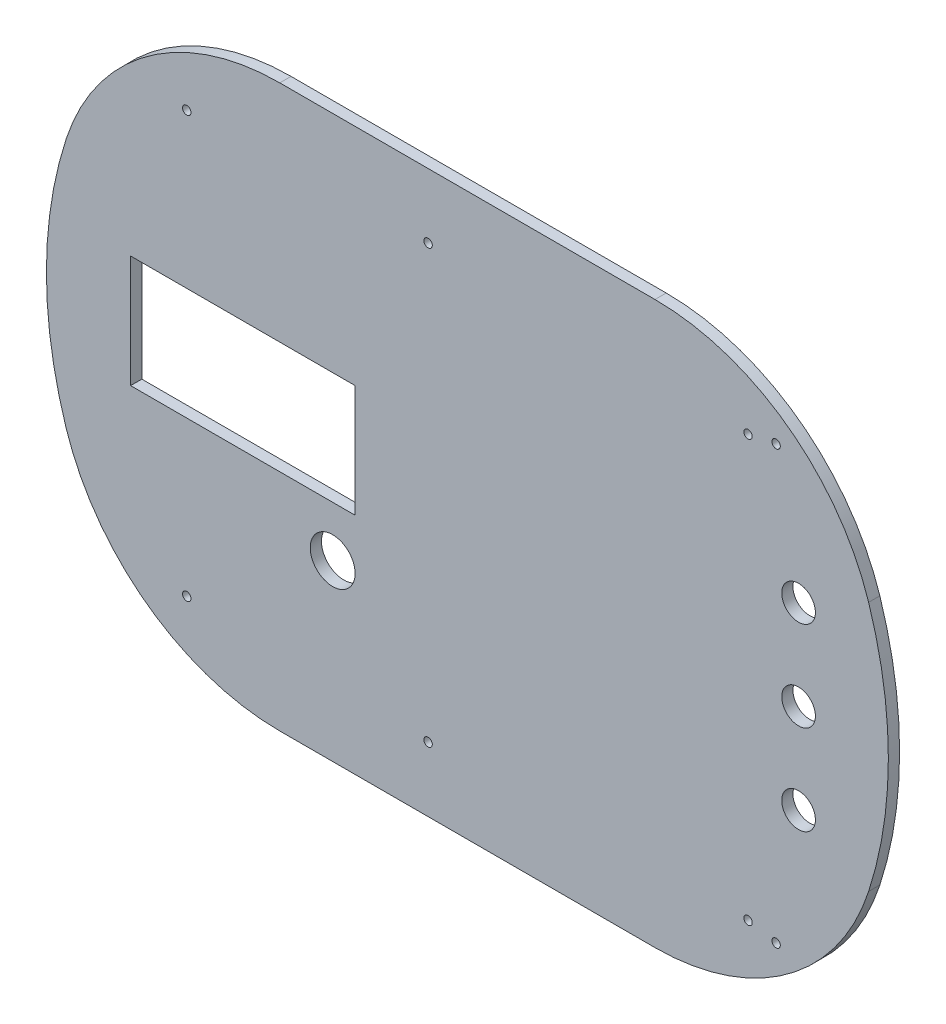
ISO-10303-21;
HEADER;
FILE_DESCRIPTION(('STEP AP214'),'2;1');
FILE_NAME('part.step','',(''),(''),'','','');
FILE_SCHEMA(('AUTOMOTIVE_DESIGN { 1 0 10303 214 1 1 1 1 }'));
ENDSEC;
DATA;
#1=APPLICATION_CONTEXT('core data for automotive mechanical design processes');
#2=APPLICATION_PROTOCOL_DEFINITION('international standard','automotive_design',2000,#1);
#3=PRODUCT_CONTEXT('',#1,'mechanical');
#4=PRODUCT('Part','Part','',(#3));
#5=PRODUCT_RELATED_PRODUCT_CATEGORY('part','',(#4));
#6=PRODUCT_DEFINITION_FORMATION('','',#4);
#7=PRODUCT_DEFINITION_CONTEXT('part definition',#1,'design');
#8=PRODUCT_DEFINITION('design','',#6,#7);
#9=PRODUCT_DEFINITION_SHAPE('','',#8);
#10=(LENGTH_UNIT() NAMED_UNIT(*) SI_UNIT(.MILLI.,.METRE.));
#11=(NAMED_UNIT(*) PLANE_ANGLE_UNIT() SI_UNIT($,.RADIAN.));
#12=(NAMED_UNIT(*) SI_UNIT($,.STERADIAN.) SOLID_ANGLE_UNIT());
#13=UNCERTAINTY_MEASURE_WITH_UNIT(LENGTH_MEASURE(1.E-05),#10,'distance_accuracy_value','');
#14=(GEOMETRIC_REPRESENTATION_CONTEXT(3) GLOBAL_UNCERTAINTY_ASSIGNED_CONTEXT((#13)) GLOBAL_UNIT_ASSIGNED_CONTEXT((#10,
#11,#12)) REPRESENTATION_CONTEXT('',''));
#15=CARTESIAN_POINT('',(0.,0.,0.));
#16=DIRECTION('',(0.,0.,1.));
#17=DIRECTION('',(1.,0.,0.));
#18=AXIS2_PLACEMENT_3D('',#15,#16,#17);
#19=CARTESIAN_POINT('',(0.,0.,2.));
#20=DIRECTION('',(0.,0.,1.));
#21=DIRECTION('',(1.,0.,0.));
#22=AXIS2_PLACEMENT_3D('',#19,#20,#21);
#23=PLANE('',#22);
#24=CARTESIAN_POINT('',(-50.,-37.5,2.));
#25=DIRECTION('',(0.,0.,1.));
#26=DIRECTION('',(1.,0.,0.));
#27=AXIS2_PLACEMENT_3D('',#24,#25,#26);
#28=CIRCLE('',#27,0.749999999999999);
#29=CARTESIAN_POINT('',(-49.25,-37.5,2.));
#30=VERTEX_POINT('',#29);
#31=EDGE_CURVE('E555',#30,#30,#28,.T.);
#32=ORIENTED_EDGE('',*,*,#31,.F.);
#33=EDGE_LOOP('',(#32));
#34=FACE_BOUND('',#33,.T.);
#35=CARTESIAN_POINT('',(50.,-37.5,2.));
#36=DIRECTION('',(0.,0.,1.));
#37=DIRECTION('',(1.,0.,0.));
#38=AXIS2_PLACEMENT_3D('',#35,#36,#37);
#39=CIRCLE('',#38,0.749999999999999);
#40=CARTESIAN_POINT('',(50.75,-37.5,2.));
#41=VERTEX_POINT('',#40);
#42=EDGE_CURVE('E557',#41,#41,#39,.T.);
#43=ORIENTED_EDGE('',*,*,#42,.F.);
#44=EDGE_LOOP('',(#43));
#45=FACE_BOUND('',#44,.T.);
#46=CARTESIAN_POINT('',(50.,37.5,2.));
#47=DIRECTION('',(0.,0.,1.));
#48=DIRECTION('',(1.,0.,0.));
#49=AXIS2_PLACEMENT_3D('',#46,#47,#48);
#50=CIRCLE('',#49,0.749999999999999);
#51=CARTESIAN_POINT('',(50.75,37.5,2.));
#52=VERTEX_POINT('',#51);
#53=EDGE_CURVE('E561',#52,#52,#50,.T.);
#54=ORIENTED_EDGE('',*,*,#53,.F.);
#55=EDGE_LOOP('',(#54));
#56=FACE_BOUND('',#55,.T.);
#57=CARTESIAN_POINT('',(-50.,37.5,2.));
#58=DIRECTION('',(0.,0.,1.));
#59=DIRECTION('',(1.,0.,0.));
#60=AXIS2_PLACEMENT_3D('',#57,#58,#59);
#61=CIRCLE('',#60,0.749999999999999);
#62=CARTESIAN_POINT('',(-49.25,37.5,2.));
#63=VERTEX_POINT('',#62);
#64=EDGE_CURVE('E297',#63,#63,#61,.T.);
#65=ORIENTED_EDGE('',*,*,#64,.F.);
#66=EDGE_LOOP('',(#65));
#67=FACE_BOUND('',#66,.T.);
#68=CARTESIAN_POINT('',(59.,16.,2.));
#69=DIRECTION('',(0.,0.,1.));
#70=DIRECTION('',(1.,0.,0.));
#71=AXIS2_PLACEMENT_3D('',#68,#69,#70);
#72=CIRCLE('',#71,3.);
#73=CARTESIAN_POINT('',(62.,16.,2.));
#74=VERTEX_POINT('',#73);
#75=EDGE_CURVE('E318',#74,#74,#72,.T.);
#76=ORIENTED_EDGE('',*,*,#75,.F.);
#77=EDGE_LOOP('',(#76));
#78=FACE_BOUND('',#77,.T.);
#79=CARTESIAN_POINT('',(55.,38.5,2.));
#80=DIRECTION('',(0.,0.,1.));
#81=DIRECTION('',(1.,0.,0.));
#82=AXIS2_PLACEMENT_3D('',#79,#80,#81);
#83=CIRCLE('',#82,0.750000000000001);
#84=CARTESIAN_POINT('',(55.75,38.5,2.));
#85=VERTEX_POINT('',#84);
#86=EDGE_CURVE('E330',#85,#85,#83,.F.);
#87=ORIENTED_EDGE('',*,*,#86,.T.);
#88=EDGE_LOOP('',(#87));
#89=FACE_BOUND('',#88,.T.);
#90=CARTESIAN_POINT('',(59.,-16.,2.));
#91=DIRECTION('',(0.,0.,1.));
#92=DIRECTION('',(1.,0.,0.));
#93=AXIS2_PLACEMENT_3D('',#90,#91,#92);
#94=CIRCLE('',#93,3.);
#95=CARTESIAN_POINT('',(62.,-16.,2.));
#96=VERTEX_POINT('',#95);
#97=EDGE_CURVE('E312',#96,#96,#94,.T.);
#98=ORIENTED_EDGE('',*,*,#97,.F.);
#99=EDGE_LOOP('',(#98));
#100=FACE_BOUND('',#99,.T.);
#101=CARTESIAN_POINT('',(59.,0.,2.));
#102=DIRECTION('',(0.,0.,1.));
#103=DIRECTION('',(1.,0.,0.));
#104=AXIS2_PLACEMENT_3D('',#101,#102,#103);
#105=CIRCLE('',#104,3.);
#106=CARTESIAN_POINT('',(62.,0.,2.));
#107=VERTEX_POINT('',#106);
#108=EDGE_CURVE('E307',#107,#107,#105,.T.);
#109=ORIENTED_EDGE('',*,*,#108,.F.);
#110=EDGE_LOOP('',(#109));
#111=FACE_BOUND('',#110,.T.);
#112=CARTESIAN_POINT('',(-6.99999999999999,38.5,2.));
#113=DIRECTION('',(0.,0.,1.));
#114=DIRECTION('',(1.,0.,0.));
#115=AXIS2_PLACEMENT_3D('',#112,#113,#114);
#116=CIRCLE('',#115,0.75);
#117=CARTESIAN_POINT('',(-6.24999999999999,38.5,2.));
#118=VERTEX_POINT('',#117);
#119=EDGE_CURVE('E268',#118,#118,#116,.T.);
#120=ORIENTED_EDGE('',*,*,#119,.F.);
#121=EDGE_LOOP('',(#120));
#122=FACE_BOUND('',#121,.T.);
#123=CARTESIAN_POINT('',(-24.,-19.,2.));
#124=DIRECTION('',(0.,0.,1.));
#125=DIRECTION('',(1.,0.,0.));
#126=AXIS2_PLACEMENT_3D('',#123,#124,#125);
#127=CIRCLE('',#126,4.);
#128=CARTESIAN_POINT('',(-20.,-19.,2.));
#129=VERTEX_POINT('',#128);
#130=EDGE_CURVE('E162',#129,#129,#127,.T.);
#131=ORIENTED_EDGE('',*,*,#130,.F.);
#132=EDGE_LOOP('',(#131));
#133=FACE_BOUND('',#132,.T.);
#134=DIRECTION('',(0.,1.,0.));
#135=VECTOR('',#134,1.);
#136=CARTESIAN_POINT('',(-20.,10.,2.));
#137=LINE('',#136,#135);
#138=CARTESIAN_POINT('',(-20.,-9.99999999999999,2.));
#139=VERTEX_POINT('',#138);
#140=CARTESIAN_POINT('',(-20.,10.,2.));
#141=VERTEX_POINT('',#140);
#142=EDGE_CURVE('E58',#139,#141,#137,.T.);
#143=ORIENTED_EDGE('',*,*,#142,.F.);
#144=DIRECTION('',(1.,0.,0.));
#145=VECTOR('',#144,1.);
#146=CARTESIAN_POINT('',(-20.,-9.99999999999999,2.));
#147=LINE('',#146,#145);
#148=CARTESIAN_POINT('',(-60.,-9.99999999999999,2.));
#149=VERTEX_POINT('',#148);
#150=EDGE_CURVE('E152',#149,#139,#147,.T.);
#151=ORIENTED_EDGE('',*,*,#150,.F.);
#152=DIRECTION('',(0.,-1.,0.));
#153=VECTOR('',#152,1.);
#154=CARTESIAN_POINT('',(-60.,10.,2.));
#155=LINE('',#154,#153);
#156=CARTESIAN_POINT('',(-60.,10.,2.));
#157=VERTEX_POINT('',#156);
#158=EDGE_CURVE('E135',#157,#149,#155,.T.);
#159=ORIENTED_EDGE('',*,*,#158,.F.);
#160=DIRECTION('',(-1.,0.,0.));
#161=VECTOR('',#160,1.);
#162=CARTESIAN_POINT('',(-20.,10.,2.));
#163=LINE('',#162,#161);
#164=EDGE_CURVE('E145',#141,#157,#163,.T.);
#165=ORIENTED_EDGE('',*,*,#164,.F.);
#166=EDGE_LOOP('',(#143,#151,#159,#165));
#167=FACE_BOUND('',#166,.T.);
#168=DIRECTION('',(1.,0.,0.));
#169=VECTOR('',#168,1.);
#170=CARTESIAN_POINT('',(0.,-50.,2.));
#171=LINE('',#170,#169);
#172=CARTESIAN_POINT('',(-33.4232921921325,-50.,2.));
#173=VERTEX_POINT('',#172);
#174=CARTESIAN_POINT('',(33.4232921921325,-50.,2.));
#175=VERTEX_POINT('',#174);
#176=EDGE_CURVE('E171',#173,#175,#171,.T.);
#177=ORIENTED_EDGE('',*,*,#176,.T.);
#178=CARTESIAN_POINT('',(33.4232921921325,-10.,2.));
#179=DIRECTION('',(0.,0.,1.));
#180=DIRECTION('',(1.,0.,0.));
#181=AXIS2_PLACEMENT_3D('',#178,#179,#180);
#182=CIRCLE('',#181,40.);
#183=CARTESIAN_POINT('',(71.4827287362955,-22.3076923076923,2.));
#184=VERTEX_POINT('',#183);
#185=EDGE_CURVE('E235',#175,#184,#182,.T.);
#186=ORIENTED_EDGE('',*,*,#185,.T.);
#187=CARTESIAN_POINT('',(2.5,0.,2.));
#188=DIRECTION('',(0.,0.,1.));
#189=DIRECTION('',(1.,0.,0.));
#190=AXIS2_PLACEMENT_3D('',#187,#188,#189);
#191=CIRCLE('',#190,72.5);
#192=CARTESIAN_POINT('',(71.4827287362955,22.3076923076923,2.));
#193=VERTEX_POINT('',#192);
#194=EDGE_CURVE('E176',#193,#184,#191,.F.);
#195=ORIENTED_EDGE('',*,*,#194,.F.);
#196=CARTESIAN_POINT('',(33.4232921921325,10.,2.));
#197=DIRECTION('',(0.,0.,1.));
#198=DIRECTION('',(1.,0.,0.));
#199=AXIS2_PLACEMENT_3D('',#196,#197,#198);
#200=CIRCLE('',#199,40.);
#201=CARTESIAN_POINT('',(33.4232921921325,50.,2.));
#202=VERTEX_POINT('',#201);
#203=EDGE_CURVE('E226',#193,#202,#200,.T.);
#204=ORIENTED_EDGE('',*,*,#203,.T.);
#205=DIRECTION('',(1.,0.,0.));
#206=VECTOR('',#205,1.);
#207=CARTESIAN_POINT('',(0.,50.,2.));
#208=LINE('',#207,#206);
#209=CARTESIAN_POINT('',(-33.4232921921325,50.,2.));
#210=VERTEX_POINT('',#209);
#211=EDGE_CURVE('E180',#210,#202,#208,.T.);
#212=ORIENTED_EDGE('',*,*,#211,.F.);
#213=CARTESIAN_POINT('',(-33.4232921921325,10.,2.));
#214=DIRECTION('',(0.,0.,1.));
#215=DIRECTION('',(1.,0.,0.));
#216=AXIS2_PLACEMENT_3D('',#213,#214,#215);
#217=CIRCLE('',#216,40.);
#218=CARTESIAN_POINT('',(-71.4827287362955,22.3076923076923,2.));
#219=VERTEX_POINT('',#218);
#220=EDGE_CURVE('E229',#210,#219,#217,.T.);
#221=ORIENTED_EDGE('',*,*,#220,.T.);
#222=CARTESIAN_POINT('',(-2.49999999999999,0.,2.));
#223=DIRECTION('',(0.,0.,1.));
#224=DIRECTION('',(1.,0.,0.));
#225=AXIS2_PLACEMENT_3D('',#222,#223,#224);
#226=CIRCLE('',#225,72.5);
#227=CARTESIAN_POINT('',(-71.4827287362955,-22.3076923076923,2.));
#228=VERTEX_POINT('',#227);
#229=EDGE_CURVE('E167',#219,#228,#226,.T.);
#230=ORIENTED_EDGE('',*,*,#229,.T.);
#231=CARTESIAN_POINT('',(-33.4232921921325,-10.,2.));
#232=DIRECTION('',(0.,0.,1.));
#233=DIRECTION('',(1.,0.,0.));
#234=AXIS2_PLACEMENT_3D('',#231,#232,#233);
#235=CIRCLE('',#234,40.);
#236=EDGE_CURVE('E232',#228,#173,#235,.T.);
#237=ORIENTED_EDGE('',*,*,#236,.T.);
#238=EDGE_LOOP('',(#177,#186,#195,#204,#212,#221,#230,#237));
#239=FACE_BOUND('',#238,.T.);
#240=CARTESIAN_POINT('',(55.,-38.5,2.));
#241=DIRECTION('',(0.,0.,1.));
#242=DIRECTION('',(1.,0.,0.));
#243=AXIS2_PLACEMENT_3D('',#240,#241,#242);
#244=CIRCLE('',#243,0.749999999999975);
#245=CARTESIAN_POINT('',(55.75,-38.5,2.));
#246=VERTEX_POINT('',#245);
#247=EDGE_CURVE('E326',#246,#246,#244,.T.);
#248=ORIENTED_EDGE('',*,*,#247,.F.);
#249=EDGE_LOOP('',(#248));
#250=FACE_BOUND('',#249,.T.);
#251=CARTESIAN_POINT('',(-6.99999999999999,-38.5,2.));
#252=DIRECTION('',(0.,0.,1.));
#253=DIRECTION('',(1.,0.,0.));
#254=AXIS2_PLACEMENT_3D('',#251,#252,#253);
#255=CIRCLE('',#254,0.750000000000015);
#256=CARTESIAN_POINT('',(-6.24999999999998,-38.5,2.));
#257=VERTEX_POINT('',#256);
#258=EDGE_CURVE('E322',#257,#257,#255,.F.);
#259=ORIENTED_EDGE('',*,*,#258,.T.);
#260=EDGE_LOOP('',(#259));
#261=FACE_BOUND('',#260,.T.);
#262=ADVANCED_FACE('F40',(#34,#45,#56,#67,#78,#89,#100,#111,#122,#133,#167,#239,#250,#261),#23,.T.);
#263=CARTESIAN_POINT('',(0.,0.,0.));
#264=DIRECTION('',(0.,0.,1.));
#265=DIRECTION('',(1.,0.,0.));
#266=AXIS2_PLACEMENT_3D('',#263,#264,#265);
#267=PLANE('',#266);
#268=CARTESIAN_POINT('',(-50.,-37.5,0.));
#269=DIRECTION('',(0.,0.,1.));
#270=DIRECTION('',(1.,0.,0.));
#271=AXIS2_PLACEMENT_3D('',#268,#269,#270);
#272=CIRCLE('',#271,0.749999999999999);
#273=CARTESIAN_POINT('',(-49.25,-37.5,0.));
#274=VERTEX_POINT('',#273);
#275=EDGE_CURVE('E44',#274,#274,#272,.T.);
#276=ORIENTED_EDGE('',*,*,#275,.T.);
#277=EDGE_LOOP('',(#276));
#278=FACE_BOUND('',#277,.T.);
#279=CARTESIAN_POINT('',(50.,-37.5,0.));
#280=DIRECTION('',(0.,0.,1.));
#281=DIRECTION('',(1.,0.,0.));
#282=AXIS2_PLACEMENT_3D('',#279,#280,#281);
#283=CIRCLE('',#282,0.749999999999999);
#284=CARTESIAN_POINT('',(50.75,-37.5,0.));
#285=VERTEX_POINT('',#284);
#286=EDGE_CURVE('E300',#285,#285,#283,.T.);
#287=ORIENTED_EDGE('',*,*,#286,.T.);
#288=EDGE_LOOP('',(#287));
#289=FACE_BOUND('',#288,.T.);
#290=CARTESIAN_POINT('',(50.,37.5,0.));
#291=DIRECTION('',(0.,0.,1.));
#292=DIRECTION('',(1.,0.,0.));
#293=AXIS2_PLACEMENT_3D('',#290,#291,#292);
#294=CIRCLE('',#293,0.749999999999999);
#295=CARTESIAN_POINT('',(50.75,37.5,0.));
#296=VERTEX_POINT('',#295);
#297=EDGE_CURVE('E296',#296,#296,#294,.T.);
#298=ORIENTED_EDGE('',*,*,#297,.T.);
#299=EDGE_LOOP('',(#298));
#300=FACE_BOUND('',#299,.T.);
#301=CARTESIAN_POINT('',(-50.,37.5,0.));
#302=DIRECTION('',(0.,0.,1.));
#303=DIRECTION('',(1.,0.,0.));
#304=AXIS2_PLACEMENT_3D('',#301,#302,#303);
#305=CIRCLE('',#304,0.749999999999999);
#306=CARTESIAN_POINT('',(-49.25,37.5,0.));
#307=VERTEX_POINT('',#306);
#308=EDGE_CURVE('E292',#307,#307,#305,.T.);
#309=ORIENTED_EDGE('',*,*,#308,.T.);
#310=EDGE_LOOP('',(#309));
#311=FACE_BOUND('',#310,.T.);
#312=CARTESIAN_POINT('',(59.,16.,0.));
#313=DIRECTION('',(0.,0.,1.));
#314=DIRECTION('',(1.,0.,0.));
#315=AXIS2_PLACEMENT_3D('',#312,#313,#314);
#316=CIRCLE('',#315,3.);
#317=CARTESIAN_POINT('',(62.,16.,0.));
#318=VERTEX_POINT('',#317);
#319=EDGE_CURVE('E288',#318,#318,#316,.T.);
#320=ORIENTED_EDGE('',*,*,#319,.T.);
#321=EDGE_LOOP('',(#320));
#322=FACE_BOUND('',#321,.T.);
#323=CARTESIAN_POINT('',(55.,-38.5,0.));
#324=DIRECTION('',(0.,0.,1.));
#325=DIRECTION('',(1.,0.,0.));
#326=AXIS2_PLACEMENT_3D('',#323,#324,#325);
#327=CIRCLE('',#326,0.749999999999975);
#328=CARTESIAN_POINT('',(55.75,-38.5,0.));
#329=VERTEX_POINT('',#328);
#330=EDGE_CURVE('E280',#329,#329,#327,.T.);
#331=ORIENTED_EDGE('',*,*,#330,.T.);
#332=EDGE_LOOP('',(#331));
#333=FACE_BOUND('',#332,.T.);
#334=CARTESIAN_POINT('',(59.,-16.,0.));
#335=DIRECTION('',(0.,0.,1.));
#336=DIRECTION('',(1.,0.,0.));
#337=AXIS2_PLACEMENT_3D('',#334,#335,#336);
#338=CIRCLE('',#337,3.);
#339=CARTESIAN_POINT('',(62.,-16.,0.));
#340=VERTEX_POINT('',#339);
#341=EDGE_CURVE('E272',#340,#340,#338,.T.);
#342=ORIENTED_EDGE('',*,*,#341,.T.);
#343=EDGE_LOOP('',(#342));
#344=FACE_BOUND('',#343,.T.);
#345=CARTESIAN_POINT('',(59.,0.,0.));
#346=DIRECTION('',(0.,0.,1.));
#347=DIRECTION('',(1.,0.,0.));
#348=AXIS2_PLACEMENT_3D('',#345,#346,#347);
#349=CIRCLE('',#348,3.);
#350=CARTESIAN_POINT('',(62.,0.,0.));
#351=VERTEX_POINT('',#350);
#352=EDGE_CURVE('E267',#351,#351,#349,.T.);
#353=ORIENTED_EDGE('',*,*,#352,.T.);
#354=EDGE_LOOP('',(#353));
#355=FACE_BOUND('',#354,.T.);
#356=CARTESIAN_POINT('',(-6.99999999999999,38.5,0.));
#357=DIRECTION('',(0.,0.,1.));
#358=DIRECTION('',(1.,0.,0.));
#359=AXIS2_PLACEMENT_3D('',#356,#357,#358);
#360=CIRCLE('',#359,0.75);
#361=CARTESIAN_POINT('',(-6.24999999999999,38.5,0.));
#362=VERTEX_POINT('',#361);
#363=EDGE_CURVE('E263',#362,#362,#360,.T.);
#364=ORIENTED_EDGE('',*,*,#363,.T.);
#365=EDGE_LOOP('',(#364));
#366=FACE_BOUND('',#365,.T.);
#367=CARTESIAN_POINT('',(-24.,-19.,0.));
#368=DIRECTION('',(0.,0.,1.));
#369=DIRECTION('',(1.,0.,0.));
#370=AXIS2_PLACEMENT_3D('',#367,#368,#369);
#371=CIRCLE('',#370,4.);
#372=CARTESIAN_POINT('',(-20.,-19.,0.));
#373=VERTEX_POINT('',#372);
#374=EDGE_CURVE('E190',#373,#373,#371,.T.);
#375=ORIENTED_EDGE('',*,*,#374,.T.);
#376=EDGE_LOOP('',(#375));
#377=FACE_BOUND('',#376,.T.);
#378=DIRECTION('',(1.,0.,0.));
#379=VECTOR('',#378,1.);
#380=CARTESIAN_POINT('',(0.,-9.99999999999999,0.));
#381=LINE('',#380,#379);
#382=CARTESIAN_POINT('',(-60.,-9.99999999999999,0.));
#383=VERTEX_POINT('',#382);
#384=CARTESIAN_POINT('',(-20.,-9.99999999999999,0.));
#385=VERTEX_POINT('',#384);
#386=EDGE_CURVE('E50',#383,#385,#381,.T.);
#387=ORIENTED_EDGE('',*,*,#386,.T.);
#388=DIRECTION('',(0.,1.,0.));
#389=VECTOR('',#388,1.);
#390=CARTESIAN_POINT('',(-20.,0.,0.));
#391=LINE('',#390,#389);
#392=CARTESIAN_POINT('',(-20.,10.,0.));
#393=VERTEX_POINT('',#392);
#394=EDGE_CURVE('E11',#385,#393,#391,.T.);
#395=ORIENTED_EDGE('',*,*,#394,.T.);
#396=DIRECTION('',(-1.,0.,0.));
#397=VECTOR('',#396,1.);
#398=CARTESIAN_POINT('',(0.,10.,0.));
#399=LINE('',#398,#397);
#400=CARTESIAN_POINT('',(-60.,10.,0.));
#401=VERTEX_POINT('',#400);
#402=EDGE_CURVE('E252',#393,#401,#399,.T.);
#403=ORIENTED_EDGE('',*,*,#402,.T.);
#404=DIRECTION('',(0.,-1.,0.));
#405=VECTOR('',#404,1.);
#406=CARTESIAN_POINT('',(-60.,0.,0.));
#407=LINE('',#406,#405);
#408=EDGE_CURVE('E138',#401,#383,#407,.T.);
#409=ORIENTED_EDGE('',*,*,#408,.T.);
#410=EDGE_LOOP('',(#387,#395,#403,#409));
#411=FACE_BOUND('',#410,.T.);
#412=CARTESIAN_POINT('',(2.5,0.,0.));
#413=DIRECTION('',(0.,0.,1.));
#414=DIRECTION('',(1.,0.,0.));
#415=AXIS2_PLACEMENT_3D('',#412,#413,#414);
#416=CIRCLE('',#415,72.5);
#417=CARTESIAN_POINT('',(71.4827287362955,22.3076923076923,0.));
#418=VERTEX_POINT('',#417);
#419=CARTESIAN_POINT('',(71.4827287362955,-22.3076923076923,0.));
#420=VERTEX_POINT('',#419);
#421=EDGE_CURVE('E194',#418,#420,#416,.F.);
#422=ORIENTED_EDGE('',*,*,#421,.T.);
#423=CARTESIAN_POINT('',(33.4232921921325,-10.,0.));
#424=DIRECTION('',(0.,0.,1.));
#425=DIRECTION('',(1.,0.,0.));
#426=AXIS2_PLACEMENT_3D('',#423,#424,#425);
#427=CIRCLE('',#426,40.);
#428=CARTESIAN_POINT('',(33.4232921921325,-50.,0.));
#429=VERTEX_POINT('',#428);
#430=EDGE_CURVE('E216',#420,#429,#427,.F.);
#431=ORIENTED_EDGE('',*,*,#430,.T.);
#432=DIRECTION('',(1.,0.,0.));
#433=VECTOR('',#432,1.);
#434=CARTESIAN_POINT('',(0.,-50.,0.));
#435=LINE('',#434,#433);
#436=CARTESIAN_POINT('',(-33.4232921921325,-50.,0.));
#437=VERTEX_POINT('',#436);
#438=EDGE_CURVE('E189',#437,#429,#435,.T.);
#439=ORIENTED_EDGE('',*,*,#438,.F.);
#440=CARTESIAN_POINT('',(-33.4232921921325,-10.,0.));
#441=DIRECTION('',(0.,0.,1.));
#442=DIRECTION('',(1.,0.,0.));
#443=AXIS2_PLACEMENT_3D('',#440,#441,#442);
#444=CIRCLE('',#443,40.);
#445=CARTESIAN_POINT('',(-71.4827287362955,-22.3076923076923,0.));
#446=VERTEX_POINT('',#445);
#447=EDGE_CURVE('E213',#437,#446,#444,.F.);
#448=ORIENTED_EDGE('',*,*,#447,.T.);
#449=CARTESIAN_POINT('',(-2.49999999999999,0.,0.));
#450=DIRECTION('',(0.,0.,1.));
#451=DIRECTION('',(1.,0.,0.));
#452=AXIS2_PLACEMENT_3D('',#449,#450,#451);
#453=CIRCLE('',#452,72.5);
#454=CARTESIAN_POINT('',(-71.4827287362955,22.3076923076923,0.));
#455=VERTEX_POINT('',#454);
#456=EDGE_CURVE('E185',#455,#446,#453,.T.);
#457=ORIENTED_EDGE('',*,*,#456,.F.);
#458=CARTESIAN_POINT('',(-33.4232921921325,10.,0.));
#459=DIRECTION('',(0.,0.,1.));
#460=DIRECTION('',(1.,0.,0.));
#461=AXIS2_PLACEMENT_3D('',#458,#459,#460);
#462=CIRCLE('',#461,40.);
#463=CARTESIAN_POINT('',(-33.4232921921325,50.,0.));
#464=VERTEX_POINT('',#463);
#465=EDGE_CURVE('E210',#455,#464,#462,.F.);
#466=ORIENTED_EDGE('',*,*,#465,.T.);
#467=DIRECTION('',(1.,0.,0.));
#468=VECTOR('',#467,1.);
#469=CARTESIAN_POINT('',(0.,50.,0.));
#470=LINE('',#469,#468);
#471=CARTESIAN_POINT('',(33.4232921921325,50.,0.));
#472=VERTEX_POINT('',#471);
#473=EDGE_CURVE('E172',#464,#472,#470,.T.);
#474=ORIENTED_EDGE('',*,*,#473,.T.);
#475=CARTESIAN_POINT('',(33.4232921921325,10.,0.));
#476=DIRECTION('',(0.,0.,1.));
#477=DIRECTION('',(1.,0.,0.));
#478=AXIS2_PLACEMENT_3D('',#475,#476,#477);
#479=CIRCLE('',#478,40.);
#480=EDGE_CURVE('E207',#472,#418,#479,.F.);
#481=ORIENTED_EDGE('',*,*,#480,.T.);
#482=EDGE_LOOP('',(#422,#431,#439,#448,#457,#466,#474,#481));
#483=FACE_BOUND('',#482,.T.);
#484=CARTESIAN_POINT('',(55.,38.5,0.));
#485=DIRECTION('',(0.,0.,1.));
#486=DIRECTION('',(1.,0.,0.));
#487=AXIS2_PLACEMENT_3D('',#484,#485,#486);
#488=CIRCLE('',#487,0.750000000000001);
#489=CARTESIAN_POINT('',(55.75,38.5,0.));
#490=VERTEX_POINT('',#489);
#491=EDGE_CURVE('E276',#490,#490,#488,.F.);
#492=ORIENTED_EDGE('',*,*,#491,.F.);
#493=EDGE_LOOP('',(#492));
#494=FACE_BOUND('',#493,.T.);
#495=CARTESIAN_POINT('',(-6.99999999999999,-38.5,0.));
#496=DIRECTION('',(0.,0.,1.));
#497=DIRECTION('',(1.,0.,0.));
#498=AXIS2_PLACEMENT_3D('',#495,#496,#497);
#499=CIRCLE('',#498,0.750000000000015);
#500=CARTESIAN_POINT('',(-6.24999999999998,-38.5,0.));
#501=VERTEX_POINT('',#500);
#502=EDGE_CURVE('E284',#501,#501,#499,.F.);
#503=ORIENTED_EDGE('',*,*,#502,.F.);
#504=EDGE_LOOP('',(#503));
#505=FACE_BOUND('',#504,.T.);
#506=ADVANCED_FACE('F349',(#278,#289,#300,#311,#322,#333,#344,#355,#366,#377,#411,#483,#494,
#505),#267,.F.);
#507=CARTESIAN_POINT('',(-2.49999999999999,0.,2.));
#508=DIRECTION('',(0.,0.,-1.));
#509=DIRECTION('',(-1.,0.,0.));
#510=AXIS2_PLACEMENT_3D('',#507,#508,#509);
#511=CYLINDRICAL_SURFACE('',#510,72.5);
#512=ORIENTED_EDGE('',*,*,#456,.T.);
#513=DIRECTION('',(0.,0.,-1.));
#514=VECTOR('',#513,1.);
#515=CARTESIAN_POINT('',(-71.4827287362955,-22.3076923076923,2.));
#516=LINE('',#515,#514);
#517=EDGE_CURVE('E242',#446,#228,#516,.F.);
#518=ORIENTED_EDGE('',*,*,#517,.T.);
#519=ORIENTED_EDGE('',*,*,#229,.F.);
#520=DIRECTION('',(0.,0.,-1.));
#521=VECTOR('',#520,1.);
#522=CARTESIAN_POINT('',(-71.4827287362955,22.3076923076923,2.));
#523=LINE('',#522,#521);
#524=EDGE_CURVE('E238',#219,#455,#523,.T.);
#525=ORIENTED_EDGE('',*,*,#524,.T.);
#526=EDGE_LOOP('',(#512,#518,#519,#525));
#527=FACE_BOUND('',#526,.T.);
#528=ADVANCED_FACE('F355',(#527),#511,.T.);
#529=CARTESIAN_POINT('',(0.,-50.,2.));
#530=DIRECTION('',(0.,1.,0.));
#531=DIRECTION('',(0.,0.,1.));
#532=AXIS2_PLACEMENT_3D('',#529,#530,#531);
#533=PLANE('',#532);
#534=ORIENTED_EDGE('',*,*,#438,.T.);
#535=DIRECTION('',(0.,0.,1.));
#536=VECTOR('',#535,1.);
#537=CARTESIAN_POINT('',(33.4232921921325,-50.,2.));
#538=LINE('',#537,#536);
#539=EDGE_CURVE('E223',#429,#175,#538,.T.);
#540=ORIENTED_EDGE('',*,*,#539,.T.);
#541=ORIENTED_EDGE('',*,*,#176,.F.);
#542=DIRECTION('',(0.,0.,-1.));
#543=VECTOR('',#542,1.);
#544=CARTESIAN_POINT('',(-33.4232921921325,-50.,2.));
#545=LINE('',#544,#543);
#546=EDGE_CURVE('E219',#173,#437,#545,.T.);
#547=ORIENTED_EDGE('',*,*,#546,.T.);
#548=EDGE_LOOP('',(#534,#540,#541,#547));
#549=FACE_BOUND('',#548,.T.);
#550=ADVANCED_FACE('F371',(#549),#533,.F.);
#551=CARTESIAN_POINT('',(2.5,0.,2.));
#552=DIRECTION('',(0.,0.,-1.));
#553=DIRECTION('',(-1.,0.,0.));
#554=AXIS2_PLACEMENT_3D('',#551,#552,#553);
#555=CYLINDRICAL_SURFACE('',#554,72.5);
#556=ORIENTED_EDGE('',*,*,#194,.T.);
#557=DIRECTION('',(0.,0.,-1.));
#558=VECTOR('',#557,1.);
#559=CARTESIAN_POINT('',(71.4827287362955,-22.3076923076923,2.));
#560=LINE('',#559,#558);
#561=EDGE_CURVE('E203',#184,#420,#560,.T.);
#562=ORIENTED_EDGE('',*,*,#561,.T.);
#563=ORIENTED_EDGE('',*,*,#421,.F.);
#564=DIRECTION('',(0.,0.,-1.));
#565=VECTOR('',#564,1.);
#566=CARTESIAN_POINT('',(71.4827287362955,22.3076923076923,2.));
#567=LINE('',#566,#565);
#568=EDGE_CURVE('E184',#418,#193,#567,.F.);
#569=ORIENTED_EDGE('',*,*,#568,.T.);
#570=EDGE_LOOP('',(#556,#562,#563,#569));
#571=FACE_BOUND('',#570,.T.);
#572=ADVANCED_FACE('F367',(#571),#555,.T.);
#573=CARTESIAN_POINT('',(0.,50.,2.));
#574=DIRECTION('',(0.,1.,0.));
#575=DIRECTION('',(0.,0.,1.));
#576=AXIS2_PLACEMENT_3D('',#573,#574,#575);
#577=PLANE('',#576);
#578=ORIENTED_EDGE('',*,*,#473,.F.);
#579=DIRECTION('',(0.,0.,1.));
#580=VECTOR('',#579,1.);
#581=CARTESIAN_POINT('',(-33.4232921921325,50.,2.));
#582=LINE('',#581,#580);
#583=EDGE_CURVE('E249',#464,#210,#582,.T.);
#584=ORIENTED_EDGE('',*,*,#583,.T.);
#585=ORIENTED_EDGE('',*,*,#211,.T.);
#586=DIRECTION('',(0.,0.,-1.));
#587=VECTOR('',#586,1.);
#588=CARTESIAN_POINT('',(33.4232921921325,50.,2.));
#589=LINE('',#588,#587);
#590=EDGE_CURVE('E245',#202,#472,#589,.T.);
#591=ORIENTED_EDGE('',*,*,#590,.T.);
#592=EDGE_LOOP('',(#578,#584,#585,#591));
#593=FACE_BOUND('',#592,.T.);
#594=ADVANCED_FACE('F363',(#593),#577,.T.);
#595=CARTESIAN_POINT('',(33.4232921921325,-10.,2.));
#596=DIRECTION('',(0.,0.,-1.));
#597=DIRECTION('',(-1.,0.,0.));
#598=AXIS2_PLACEMENT_3D('',#595,#596,#597);
#599=CYLINDRICAL_SURFACE('',#598,40.);
#600=ORIENTED_EDGE('',*,*,#185,.F.);
#601=ORIENTED_EDGE('',*,*,#539,.F.);
#602=ORIENTED_EDGE('',*,*,#430,.F.);
#603=ORIENTED_EDGE('',*,*,#561,.F.);
#604=EDGE_LOOP('',(#600,#601,#602,#603));
#605=FACE_BOUND('',#604,.T.);
#606=ADVANCED_FACE('F366',(#605),#599,.T.);
#607=CARTESIAN_POINT('',(-33.4232921921325,-10.,2.));
#608=DIRECTION('',(0.,0.,-1.));
#609=DIRECTION('',(-1.,0.,0.));
#610=AXIS2_PLACEMENT_3D('',#607,#608,#609);
#611=CYLINDRICAL_SURFACE('',#610,40.);
#612=ORIENTED_EDGE('',*,*,#236,.F.);
#613=ORIENTED_EDGE('',*,*,#517,.F.);
#614=ORIENTED_EDGE('',*,*,#447,.F.);
#615=ORIENTED_EDGE('',*,*,#546,.F.);
#616=EDGE_LOOP('',(#612,#613,#614,#615));
#617=FACE_BOUND('',#616,.T.);
#618=ADVANCED_FACE('F381',(#617),#611,.T.);
#619=CARTESIAN_POINT('',(-33.4232921921325,10.,2.));
#620=DIRECTION('',(0.,0.,-1.));
#621=DIRECTION('',(-1.,0.,0.));
#622=AXIS2_PLACEMENT_3D('',#619,#620,#621);
#623=CYLINDRICAL_SURFACE('',#622,40.);
#624=ORIENTED_EDGE('',*,*,#220,.F.);
#625=ORIENTED_EDGE('',*,*,#583,.F.);
#626=ORIENTED_EDGE('',*,*,#465,.F.);
#627=ORIENTED_EDGE('',*,*,#524,.F.);
#628=EDGE_LOOP('',(#624,#625,#626,#627));
#629=FACE_BOUND('',#628,.T.);
#630=ADVANCED_FACE('F384',(#629),#623,.T.);
#631=CARTESIAN_POINT('',(33.4232921921325,10.,2.));
#632=DIRECTION('',(0.,0.,-1.));
#633=DIRECTION('',(-1.,0.,0.));
#634=AXIS2_PLACEMENT_3D('',#631,#632,#633);
#635=CYLINDRICAL_SURFACE('',#634,40.);
#636=ORIENTED_EDGE('',*,*,#203,.F.);
#637=ORIENTED_EDGE('',*,*,#568,.F.);
#638=ORIENTED_EDGE('',*,*,#480,.F.);
#639=ORIENTED_EDGE('',*,*,#590,.F.);
#640=EDGE_LOOP('',(#636,#637,#638,#639));
#641=FACE_BOUND('',#640,.T.);
#642=ADVANCED_FACE('F42',(#641),#635,.T.);
#643=CARTESIAN_POINT('',(-20.,10.,-1.));
#644=DIRECTION('',(1.,0.,0.));
#645=DIRECTION('',(0.,0.,-1.));
#646=AXIS2_PLACEMENT_3D('',#643,#644,#645);
#647=PLANE('',#646);
#648=DIRECTION('',(0.,0.,1.));
#649=VECTOR('',#648,1.);
#650=CARTESIAN_POINT('',(-20.,-9.99999999999999,-1.));
#651=LINE('',#650,#649);
#652=EDGE_CURVE('E159',#385,#139,#651,.T.);
#653=ORIENTED_EDGE('',*,*,#652,.T.);
#654=ORIENTED_EDGE('',*,*,#142,.T.);
#655=DIRECTION('',(0.,0.,1.));
#656=VECTOR('',#655,1.);
#657=CARTESIAN_POINT('',(-20.,10.,-1.));
#658=LINE('',#657,#656);
#659=EDGE_CURVE('E142',#393,#141,#658,.T.);
#660=ORIENTED_EDGE('',*,*,#659,.F.);
#661=ORIENTED_EDGE('',*,*,#394,.F.);
#662=EDGE_LOOP('',(#653,#654,#660,#661));
#663=FACE_BOUND('',#662,.T.);
#664=ADVANCED_FACE('F360',(#663),#647,.F.);
#665=CARTESIAN_POINT('',(-20.,-9.99999999999999,-1.));
#666=DIRECTION('',(0.,-1.,0.));
#667=DIRECTION('',(0.,0.,-1.));
#668=AXIS2_PLACEMENT_3D('',#665,#666,#667);
#669=PLANE('',#668);
#670=DIRECTION('',(0.,0.,1.));
#671=VECTOR('',#670,1.);
#672=CARTESIAN_POINT('',(-60.,-9.99999999999999,-1.));
#673=LINE('',#672,#671);
#674=EDGE_CURVE('E141',#383,#149,#673,.T.);
#675=ORIENTED_EDGE('',*,*,#674,.T.);
#676=ORIENTED_EDGE('',*,*,#150,.T.);
#677=ORIENTED_EDGE('',*,*,#652,.F.);
#678=ORIENTED_EDGE('',*,*,#386,.F.);
#679=EDGE_LOOP('',(#675,#676,#677,#678));
#680=FACE_BOUND('',#679,.T.);
#681=ADVANCED_FACE('F450',(#680),#669,.F.);
#682=CARTESIAN_POINT('',(-60.,10.,-1.));
#683=DIRECTION('',(-1.,0.,0.));
#684=DIRECTION('',(0.,0.,1.));
#685=AXIS2_PLACEMENT_3D('',#682,#683,#684);
#686=PLANE('',#685);
#687=DIRECTION('',(0.,0.,1.));
#688=VECTOR('',#687,1.);
#689=CARTESIAN_POINT('',(-60.,10.,-1.));
#690=LINE('',#689,#688);
#691=EDGE_CURVE('E66',#401,#157,#690,.T.);
#692=ORIENTED_EDGE('',*,*,#691,.T.);
#693=ORIENTED_EDGE('',*,*,#158,.T.);
#694=ORIENTED_EDGE('',*,*,#674,.F.);
#695=ORIENTED_EDGE('',*,*,#408,.F.);
#696=EDGE_LOOP('',(#692,#693,#694,#695));
#697=FACE_BOUND('',#696,.T.);
#698=ADVANCED_FACE('F132',(#697),#686,.F.);
#699=CARTESIAN_POINT('',(-20.,10.,-1.));
#700=DIRECTION('',(0.,1.,0.));
#701=DIRECTION('',(0.,0.,1.));
#702=AXIS2_PLACEMENT_3D('',#699,#700,#701);
#703=PLANE('',#702);
#704=ORIENTED_EDGE('',*,*,#659,.T.);
#705=ORIENTED_EDGE('',*,*,#164,.T.);
#706=ORIENTED_EDGE('',*,*,#691,.F.);
#707=ORIENTED_EDGE('',*,*,#402,.F.);
#708=EDGE_LOOP('',(#704,#705,#706,#707));
#709=FACE_BOUND('',#708,.T.);
#710=ADVANCED_FACE('F146',(#709),#703,.F.);
#711=CARTESIAN_POINT('',(-24.,-19.,-1.));
#712=DIRECTION('',(0.,0.,1.));
#713=DIRECTION('',(1.,0.,0.));
#714=AXIS2_PLACEMENT_3D('',#711,#712,#713);
#715=CYLINDRICAL_SURFACE('',#714,4.);
#716=ORIENTED_EDGE('',*,*,#130,.T.);
#717=EDGE_LOOP('',(#716));
#718=FACE_BOUND('',#717,.T.);
#719=ORIENTED_EDGE('',*,*,#374,.F.);
#720=EDGE_LOOP('',(#719));
#721=FACE_BOUND('',#720,.T.);
#722=ADVANCED_FACE('F345',(#718,#721),#715,.F.);
#723=CARTESIAN_POINT('',(-6.99999999999999,38.5,-8.));
#724=DIRECTION('',(0.,0.,1.));
#725=DIRECTION('',(1.,0.,0.));
#726=AXIS2_PLACEMENT_3D('',#723,#724,#725);
#727=CYLINDRICAL_SURFACE('',#726,0.75);
#728=ORIENTED_EDGE('',*,*,#119,.T.);
#729=EDGE_LOOP('',(#728));
#730=FACE_BOUND('',#729,.T.);
#731=ORIENTED_EDGE('',*,*,#363,.F.);
#732=EDGE_LOOP('',(#731));
#733=FACE_BOUND('',#732,.T.);
#734=ADVANCED_FACE('F444',(#730,#733),#727,.F.);
#735=CARTESIAN_POINT('',(59.,0.,-8.));
#736=DIRECTION('',(0.,0.,1.));
#737=DIRECTION('',(1.,0.,0.));
#738=AXIS2_PLACEMENT_3D('',#735,#736,#737);
#739=CYLINDRICAL_SURFACE('',#738,3.);
#740=ORIENTED_EDGE('',*,*,#108,.T.);
#741=EDGE_LOOP('',(#740));
#742=FACE_BOUND('',#741,.T.);
#743=ORIENTED_EDGE('',*,*,#352,.F.);
#744=EDGE_LOOP('',(#743));
#745=FACE_BOUND('',#744,.T.);
#746=ADVANCED_FACE('F437',(#742,#745),#739,.F.);
#747=CARTESIAN_POINT('',(59.,-16.,-8.));
#748=DIRECTION('',(0.,0.,1.));
#749=DIRECTION('',(1.,0.,0.));
#750=AXIS2_PLACEMENT_3D('',#747,#748,#749);
#751=CYLINDRICAL_SURFACE('',#750,3.);
#752=ORIENTED_EDGE('',*,*,#97,.T.);
#753=EDGE_LOOP('',(#752));
#754=FACE_BOUND('',#753,.T.);
#755=ORIENTED_EDGE('',*,*,#341,.F.);
#756=EDGE_LOOP('',(#755));
#757=FACE_BOUND('',#756,.T.);
#758=ADVANCED_FACE('F441',(#754,#757),#751,.F.);
#759=CARTESIAN_POINT('',(55.,38.5,-8.));
#760=DIRECTION('',(0.,0.,1.));
#761=DIRECTION('',(1.,0.,0.));
#762=AXIS2_PLACEMENT_3D('',#759,#760,#761);
#763=CYLINDRICAL_SURFACE('',#762,0.750000000000001);
#764=ORIENTED_EDGE('',*,*,#86,.F.);
#765=EDGE_LOOP('',(#764));
#766=FACE_BOUND('',#765,.T.);
#767=ORIENTED_EDGE('',*,*,#491,.T.);
#768=EDGE_LOOP('',(#767));
#769=FACE_BOUND('',#768,.T.);
#770=ADVANCED_FACE('F432',(#766,#769),#763,.F.);
#771=CARTESIAN_POINT('',(55.,-38.5,-8.));
#772=DIRECTION('',(0.,0.,1.));
#773=DIRECTION('',(1.,0.,0.));
#774=AXIS2_PLACEMENT_3D('',#771,#772,#773);
#775=CYLINDRICAL_SURFACE('',#774,0.749999999999975);
#776=ORIENTED_EDGE('',*,*,#247,.T.);
#777=EDGE_LOOP('',(#776));
#778=FACE_BOUND('',#777,.T.);
#779=ORIENTED_EDGE('',*,*,#330,.F.);
#780=EDGE_LOOP('',(#779));
#781=FACE_BOUND('',#780,.T.);
#782=ADVANCED_FACE('F422',(#778,#781),#775,.F.);
#783=CARTESIAN_POINT('',(-6.99999999999999,-38.5,-8.));
#784=DIRECTION('',(0.,0.,1.));
#785=DIRECTION('',(1.,0.,0.));
#786=AXIS2_PLACEMENT_3D('',#783,#784,#785);
#787=CYLINDRICAL_SURFACE('',#786,0.750000000000015);
#788=ORIENTED_EDGE('',*,*,#258,.F.);
#789=EDGE_LOOP('',(#788));
#790=FACE_BOUND('',#789,.T.);
#791=ORIENTED_EDGE('',*,*,#502,.T.);
#792=EDGE_LOOP('',(#791));
#793=FACE_BOUND('',#792,.T.);
#794=ADVANCED_FACE('F419',(#790,#793),#787,.F.);
#795=CARTESIAN_POINT('',(59.,16.,-8.));
#796=DIRECTION('',(0.,0.,1.));
#797=DIRECTION('',(1.,0.,0.));
#798=AXIS2_PLACEMENT_3D('',#795,#796,#797);
#799=CYLINDRICAL_SURFACE('',#798,3.);
#800=ORIENTED_EDGE('',*,*,#75,.T.);
#801=EDGE_LOOP('',(#800));
#802=FACE_BOUND('',#801,.T.);
#803=ORIENTED_EDGE('',*,*,#319,.F.);
#804=EDGE_LOOP('',(#803));
#805=FACE_BOUND('',#804,.T.);
#806=ADVANCED_FACE('F421',(#802,#805),#799,.F.);
#807=CARTESIAN_POINT('',(-50.,37.5,-8.));
#808=DIRECTION('',(0.,0.,1.));
#809=DIRECTION('',(1.,0.,0.));
#810=AXIS2_PLACEMENT_3D('',#807,#808,#809);
#811=CYLINDRICAL_SURFACE('',#810,0.749999999999999);
#812=ORIENTED_EDGE('',*,*,#64,.T.);
#813=EDGE_LOOP('',(#812));
#814=FACE_BOUND('',#813,.T.);
#815=ORIENTED_EDGE('',*,*,#308,.F.);
#816=EDGE_LOOP('',(#815));
#817=FACE_BOUND('',#816,.T.);
#818=ADVANCED_FACE('F429',(#814,#817),#811,.F.);
#819=CARTESIAN_POINT('',(50.,37.5,-8.));
#820=DIRECTION('',(0.,0.,1.));
#821=DIRECTION('',(1.,0.,0.));
#822=AXIS2_PLACEMENT_3D('',#819,#820,#821);
#823=CYLINDRICAL_SURFACE('',#822,0.749999999999999);
#824=ORIENTED_EDGE('',*,*,#53,.T.);
#825=EDGE_LOOP('',(#824));
#826=FACE_BOUND('',#825,.T.);
#827=ORIENTED_EDGE('',*,*,#297,.F.);
#828=EDGE_LOOP('',(#827));
#829=FACE_BOUND('',#828,.T.);
#830=ADVANCED_FACE('F519',(#826,#829),#823,.F.);
#831=CARTESIAN_POINT('',(50.,-37.5,-8.));
#832=DIRECTION('',(0.,0.,1.));
#833=DIRECTION('',(1.,0.,0.));
#834=AXIS2_PLACEMENT_3D('',#831,#832,#833);
#835=CYLINDRICAL_SURFACE('',#834,0.749999999999999);
#836=ORIENTED_EDGE('',*,*,#42,.T.);
#837=EDGE_LOOP('',(#836));
#838=FACE_BOUND('',#837,.T.);
#839=ORIENTED_EDGE('',*,*,#286,.F.);
#840=EDGE_LOOP('',(#839));
#841=FACE_BOUND('',#840,.T.);
#842=ADVANCED_FACE('F529',(#838,#841),#835,.F.);
#843=CARTESIAN_POINT('',(-50.,-37.5,-8.));
#844=DIRECTION('',(0.,0.,1.));
#845=DIRECTION('',(1.,0.,0.));
#846=AXIS2_PLACEMENT_3D('',#843,#844,#845);
#847=CYLINDRICAL_SURFACE('',#846,0.749999999999999);
#848=ORIENTED_EDGE('',*,*,#31,.T.);
#849=EDGE_LOOP('',(#848));
#850=FACE_BOUND('',#849,.T.);
#851=ORIENTED_EDGE('',*,*,#275,.F.);
#852=EDGE_LOOP('',(#851));
#853=FACE_BOUND('',#852,.T.);
#854=ADVANCED_FACE('F539',(#850,#853),#847,.F.);
#855=CLOSED_SHELL('',(#262,#506,#528,#550,#572,#594,#606,#618,#630,#642,#664,#681,#698,#710,
#722,#734,#746,#758,#770,#782,#794,#806,#818,#830,#842,#854));
#856=MANIFOLD_SOLID_BREP('B2',#855);
#857=ADVANCED_BREP_SHAPE_REPRESENTATION('',(#18,#856),#14);
#858=SHAPE_DEFINITION_REPRESENTATION(#9,#857);
ENDSEC;
END-ISO-10303-21;
